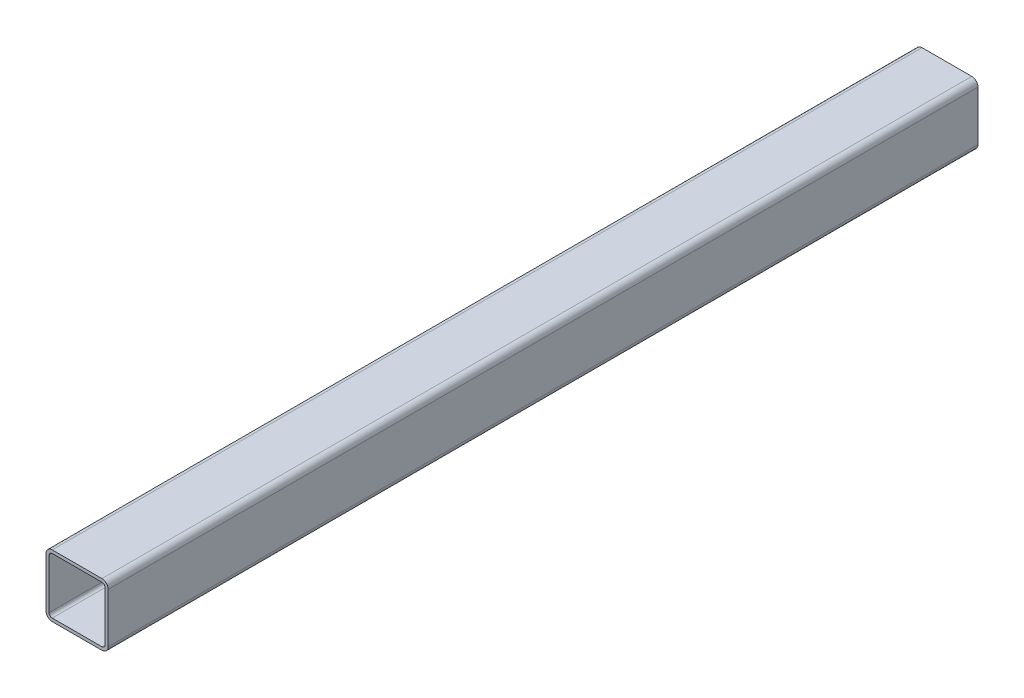
ISO-10303-21;
HEADER;
FILE_DESCRIPTION(('STEP AP214'),'2;1');
FILE_NAME('part.step','',(''),(''),'','','');
FILE_SCHEMA(('AUTOMOTIVE_DESIGN { 1 0 10303 214 1 1 1 1 }'));
ENDSEC;
DATA;
#1=APPLICATION_CONTEXT('core data for automotive mechanical design processes');
#2=APPLICATION_PROTOCOL_DEFINITION('international standard','automotive_design',2000,#1);
#3=PRODUCT_CONTEXT('',#1,'mechanical');
#4=PRODUCT('Part','Part','',(#3));
#5=PRODUCT_RELATED_PRODUCT_CATEGORY('part','',(#4));
#6=PRODUCT_DEFINITION_FORMATION('','',#4);
#7=PRODUCT_DEFINITION_CONTEXT('part definition',#1,'design');
#8=PRODUCT_DEFINITION('design','',#6,#7);
#9=PRODUCT_DEFINITION_SHAPE('','',#8);
#10=(LENGTH_UNIT() NAMED_UNIT(*) SI_UNIT(.MILLI.,.METRE.));
#11=(NAMED_UNIT(*) PLANE_ANGLE_UNIT() SI_UNIT($,.RADIAN.));
#12=(NAMED_UNIT(*) SI_UNIT($,.STERADIAN.) SOLID_ANGLE_UNIT());
#13=UNCERTAINTY_MEASURE_WITH_UNIT(LENGTH_MEASURE(1.E-05),#10,'distance_accuracy_value','');
#14=(GEOMETRIC_REPRESENTATION_CONTEXT(3) GLOBAL_UNCERTAINTY_ASSIGNED_CONTEXT((#13)) GLOBAL_UNIT_ASSIGNED_CONTEXT((#10,
#11,#12)) REPRESENTATION_CONTEXT('',''));
#15=CARTESIAN_POINT('',(0.,0.,0.));
#16=DIRECTION('',(0.,0.,1.));
#17=DIRECTION('',(1.,0.,0.));
#18=AXIS2_PLACEMENT_3D('',#15,#16,#17);
#19=CARTESIAN_POINT('',(16.,-16.,560.));
#20=DIRECTION('',(0.,0.,-1.));
#21=DIRECTION('',(-1.,0.,0.));
#22=AXIS2_PLACEMENT_3D('',#19,#20,#21);
#23=PLANE('',#22);
#24=CARTESIAN_POINT('',(16.,-16.,560.));
#25=DIRECTION('',(0.,0.,1.));
#26=DIRECTION('',(-1.,0.,0.));
#27=AXIS2_PLACEMENT_3D('',#24,#25,#26);
#28=CIRCLE('',#27,4.);
#29=CARTESIAN_POINT('',(16.,-20.,560.));
#30=VERTEX_POINT('',#29);
#31=CARTESIAN_POINT('',(20.,-16.,560.));
#32=VERTEX_POINT('',#31);
#33=EDGE_CURVE('E212',#30,#32,#28,.T.);
#34=ORIENTED_EDGE('',*,*,#33,.T.);
#35=DIRECTION('',(0.,1.,0.));
#36=VECTOR('',#35,1.);
#37=CARTESIAN_POINT('',(20.,16.,560.));
#38=LINE('',#37,#36);
#39=CARTESIAN_POINT('',(20.,16.,560.));
#40=VERTEX_POINT('',#39);
#41=EDGE_CURVE('E215',#32,#40,#38,.T.);
#42=ORIENTED_EDGE('',*,*,#41,.T.);
#43=CARTESIAN_POINT('',(16.,16.,560.));
#44=DIRECTION('',(0.,0.,1.));
#45=DIRECTION('',(-1.,0.,0.));
#46=AXIS2_PLACEMENT_3D('',#43,#44,#45);
#47=CIRCLE('',#46,4.);
#48=CARTESIAN_POINT('',(16.,20.,560.));
#49=VERTEX_POINT('',#48);
#50=EDGE_CURVE('E218',#40,#49,#47,.T.);
#51=ORIENTED_EDGE('',*,*,#50,.T.);
#52=DIRECTION('',(-1.,0.,0.));
#53=VECTOR('',#52,1.);
#54=CARTESIAN_POINT('',(-16.,20.,560.));
#55=LINE('',#54,#53);
#56=CARTESIAN_POINT('',(-16.,20.,560.));
#57=VERTEX_POINT('',#56);
#58=EDGE_CURVE('E220',#49,#57,#55,.T.);
#59=ORIENTED_EDGE('',*,*,#58,.T.);
#60=CARTESIAN_POINT('',(-16.,16.,560.));
#61=DIRECTION('',(0.,0.,1.));
#62=DIRECTION('',(1.,0.,0.));
#63=AXIS2_PLACEMENT_3D('',#60,#61,#62);
#64=CIRCLE('',#63,4.);
#65=CARTESIAN_POINT('',(-20.,16.,560.));
#66=VERTEX_POINT('',#65);
#67=EDGE_CURVE('E222',#57,#66,#64,.T.);
#68=ORIENTED_EDGE('',*,*,#67,.T.);
#69=DIRECTION('',(0.,-1.,0.));
#70=VECTOR('',#69,1.);
#71=CARTESIAN_POINT('',(-20.,16.,560.));
#72=LINE('',#71,#70);
#73=CARTESIAN_POINT('',(-20.,-16.,560.));
#74=VERTEX_POINT('',#73);
#75=EDGE_CURVE('E224',#66,#74,#72,.T.);
#76=ORIENTED_EDGE('',*,*,#75,.T.);
#77=CARTESIAN_POINT('',(-16.,-16.,560.));
#78=DIRECTION('',(0.,0.,1.));
#79=DIRECTION('',(1.,0.,0.));
#80=AXIS2_PLACEMENT_3D('',#77,#78,#79);
#81=CIRCLE('',#80,4.);
#82=CARTESIAN_POINT('',(-16.,-20.,560.));
#83=VERTEX_POINT('',#82);
#84=EDGE_CURVE('E226',#74,#83,#81,.T.);
#85=ORIENTED_EDGE('',*,*,#84,.T.);
#86=DIRECTION('',(1.,0.,0.));
#87=VECTOR('',#86,1.);
#88=CARTESIAN_POINT('',(-16.,-20.,560.));
#89=LINE('',#88,#87);
#90=EDGE_CURVE('E228',#83,#30,#89,.T.);
#91=ORIENTED_EDGE('',*,*,#90,.T.);
#92=EDGE_LOOP('',(#34,#42,#51,#59,#68,#76,#85,#91));
#93=FACE_BOUND('',#92,.T.);
#94=CARTESIAN_POINT('',(-16.,16.,560.));
#95=DIRECTION('',(0.,0.,1.));
#96=DIRECTION('',(1.,0.,0.));
#97=AXIS2_PLACEMENT_3D('',#94,#95,#96);
#98=CIRCLE('',#97,2.);
#99=CARTESIAN_POINT('',(-16.,18.,560.));
#100=VERTEX_POINT('',#99);
#101=CARTESIAN_POINT('',(-18.,16.,560.));
#102=VERTEX_POINT('',#101);
#103=EDGE_CURVE('E147',#100,#102,#98,.T.);
#104=ORIENTED_EDGE('',*,*,#103,.F.);
#105=DIRECTION('',(-1.,0.,0.));
#106=VECTOR('',#105,1.);
#107=CARTESIAN_POINT('',(-16.,18.,560.));
#108=LINE('',#107,#106);
#109=CARTESIAN_POINT('',(16.,18.,560.));
#110=VERTEX_POINT('',#109);
#111=EDGE_CURVE('E180',#110,#100,#108,.T.);
#112=ORIENTED_EDGE('',*,*,#111,.F.);
#113=CARTESIAN_POINT('',(16.,16.,560.));
#114=DIRECTION('',(0.,0.,1.));
#115=DIRECTION('',(-1.,0.,0.));
#116=AXIS2_PLACEMENT_3D('',#113,#114,#115);
#117=CIRCLE('',#116,2.);
#118=CARTESIAN_POINT('',(18.,16.,560.));
#119=VERTEX_POINT('',#118);
#120=EDGE_CURVE('E178',#119,#110,#117,.T.);
#121=ORIENTED_EDGE('',*,*,#120,.F.);
#122=DIRECTION('',(0.,1.,0.));
#123=VECTOR('',#122,1.);
#124=CARTESIAN_POINT('',(18.,16.,560.));
#125=LINE('',#124,#123);
#126=CARTESIAN_POINT('',(18.,-16.,560.));
#127=VERTEX_POINT('',#126);
#128=EDGE_CURVE('E176',#127,#119,#125,.T.);
#129=ORIENTED_EDGE('',*,*,#128,.F.);
#130=CARTESIAN_POINT('',(16.,-16.,560.));
#131=DIRECTION('',(0.,0.,1.));
#132=DIRECTION('',(-1.,0.,0.));
#133=AXIS2_PLACEMENT_3D('',#130,#131,#132);
#134=CIRCLE('',#133,2.);
#135=CARTESIAN_POINT('',(16.,-18.,560.));
#136=VERTEX_POINT('',#135);
#137=EDGE_CURVE('E174',#136,#127,#134,.T.);
#138=ORIENTED_EDGE('',*,*,#137,.F.);
#139=DIRECTION('',(1.,0.,0.));
#140=VECTOR('',#139,1.);
#141=CARTESIAN_POINT('',(-16.,-18.,560.));
#142=LINE('',#141,#140);
#143=CARTESIAN_POINT('',(-16.,-18.,560.));
#144=VERTEX_POINT('',#143);
#145=EDGE_CURVE('E170',#144,#136,#142,.T.);
#146=ORIENTED_EDGE('',*,*,#145,.F.);
#147=CARTESIAN_POINT('',(-16.,-16.,560.));
#148=DIRECTION('',(0.,0.,1.));
#149=DIRECTION('',(1.,0.,0.));
#150=AXIS2_PLACEMENT_3D('',#147,#148,#149);
#151=CIRCLE('',#150,2.);
#152=CARTESIAN_POINT('',(-18.,-16.,560.));
#153=VERTEX_POINT('',#152);
#154=EDGE_CURVE('E168',#153,#144,#151,.T.);
#155=ORIENTED_EDGE('',*,*,#154,.F.);
#156=DIRECTION('',(0.,-1.,0.));
#157=VECTOR('',#156,1.);
#158=CARTESIAN_POINT('',(-18.,16.,560.));
#159=LINE('',#158,#157);
#160=EDGE_CURVE('E155',#102,#153,#159,.T.);
#161=ORIENTED_EDGE('',*,*,#160,.F.);
#162=EDGE_LOOP('',(#104,#112,#121,#129,#138,#146,#155,#161));
#163=FACE_BOUND('',#162,.T.);
#164=ADVANCED_FACE('F34',(#93,#163),#23,.F.);
#165=CARTESIAN_POINT('',(16.,-16.,0.));
#166=DIRECTION('',(0.,0.,-1.));
#167=DIRECTION('',(-1.,0.,0.));
#168=AXIS2_PLACEMENT_3D('',#165,#166,#167);
#169=PLANE('',#168);
#170=CARTESIAN_POINT('',(16.,-16.,0.));
#171=DIRECTION('',(0.,0.,1.));
#172=DIRECTION('',(-1.,0.,0.));
#173=AXIS2_PLACEMENT_3D('',#170,#171,#172);
#174=CIRCLE('',#173,4.);
#175=CARTESIAN_POINT('',(16.,-20.,0.));
#176=VERTEX_POINT('',#175);
#177=CARTESIAN_POINT('',(20.,-16.,0.));
#178=VERTEX_POINT('',#177);
#179=EDGE_CURVE('E163',#176,#178,#174,.T.);
#180=ORIENTED_EDGE('',*,*,#179,.F.);
#181=DIRECTION('',(1.,0.,0.));
#182=VECTOR('',#181,1.);
#183=CARTESIAN_POINT('',(-16.,-20.,0.));
#184=LINE('',#183,#182);
#185=CARTESIAN_POINT('',(-16.,-20.,0.));
#186=VERTEX_POINT('',#185);
#187=EDGE_CURVE('E216',#186,#176,#184,.T.);
#188=ORIENTED_EDGE('',*,*,#187,.F.);
#189=CARTESIAN_POINT('',(-16.,-16.,0.));
#190=DIRECTION('',(0.,0.,1.));
#191=DIRECTION('',(1.,0.,0.));
#192=AXIS2_PLACEMENT_3D('',#189,#190,#191);
#193=CIRCLE('',#192,4.);
#194=CARTESIAN_POINT('',(-20.,-16.,0.));
#195=VERTEX_POINT('',#194);
#196=EDGE_CURVE('E243',#195,#186,#193,.T.);
#197=ORIENTED_EDGE('',*,*,#196,.F.);
#198=DIRECTION('',(0.,-1.,0.));
#199=VECTOR('',#198,1.);
#200=CARTESIAN_POINT('',(-20.,16.,0.));
#201=LINE('',#200,#199);
#202=CARTESIAN_POINT('',(-20.,16.,0.));
#203=VERTEX_POINT('',#202);
#204=EDGE_CURVE('E241',#203,#195,#201,.T.);
#205=ORIENTED_EDGE('',*,*,#204,.F.);
#206=CARTESIAN_POINT('',(-16.,16.,0.));
#207=DIRECTION('',(0.,0.,1.));
#208=DIRECTION('',(1.,0.,0.));
#209=AXIS2_PLACEMENT_3D('',#206,#207,#208);
#210=CIRCLE('',#209,4.);
#211=CARTESIAN_POINT('',(-16.,20.,0.));
#212=VERTEX_POINT('',#211);
#213=EDGE_CURVE('E239',#212,#203,#210,.T.);
#214=ORIENTED_EDGE('',*,*,#213,.F.);
#215=DIRECTION('',(-1.,0.,0.));
#216=VECTOR('',#215,1.);
#217=CARTESIAN_POINT('',(-16.,20.,0.));
#218=LINE('',#217,#216);
#219=CARTESIAN_POINT('',(16.,20.,0.));
#220=VERTEX_POINT('',#219);
#221=EDGE_CURVE('E237',#220,#212,#218,.T.);
#222=ORIENTED_EDGE('',*,*,#221,.F.);
#223=CARTESIAN_POINT('',(16.,16.,0.));
#224=DIRECTION('',(0.,0.,1.));
#225=DIRECTION('',(-1.,0.,0.));
#226=AXIS2_PLACEMENT_3D('',#223,#224,#225);
#227=CIRCLE('',#226,4.);
#228=CARTESIAN_POINT('',(20.,16.,0.));
#229=VERTEX_POINT('',#228);
#230=EDGE_CURVE('E235',#229,#220,#227,.T.);
#231=ORIENTED_EDGE('',*,*,#230,.F.);
#232=DIRECTION('',(0.,1.,0.));
#233=VECTOR('',#232,1.);
#234=CARTESIAN_POINT('',(20.,16.,0.));
#235=LINE('',#234,#233);
#236=EDGE_CURVE('E233',#178,#229,#235,.T.);
#237=ORIENTED_EDGE('',*,*,#236,.F.);
#238=EDGE_LOOP('',(#180,#188,#197,#205,#214,#222,#231,#237));
#239=FACE_BOUND('',#238,.T.);
#240=DIRECTION('',(-1.,0.,0.));
#241=VECTOR('',#240,1.);
#242=CARTESIAN_POINT('',(-16.,18.,0.));
#243=LINE('',#242,#241);
#244=CARTESIAN_POINT('',(16.,18.,0.));
#245=VERTEX_POINT('',#244);
#246=CARTESIAN_POINT('',(-16.,18.,0.));
#247=VERTEX_POINT('',#246);
#248=EDGE_CURVE('E156',#245,#247,#243,.T.);
#249=ORIENTED_EDGE('',*,*,#248,.T.);
#250=CARTESIAN_POINT('',(-16.,16.,0.));
#251=DIRECTION('',(0.,0.,1.));
#252=DIRECTION('',(1.,0.,0.));
#253=AXIS2_PLACEMENT_3D('',#250,#251,#252);
#254=CIRCLE('',#253,2.);
#255=CARTESIAN_POINT('',(-18.,16.,0.));
#256=VERTEX_POINT('',#255);
#257=EDGE_CURVE('E57',#247,#256,#254,.T.);
#258=ORIENTED_EDGE('',*,*,#257,.T.);
#259=DIRECTION('',(0.,-1.,0.));
#260=VECTOR('',#259,1.);
#261=CARTESIAN_POINT('',(-18.,16.,0.));
#262=LINE('',#261,#260);
#263=CARTESIAN_POINT('',(-18.,-16.,0.));
#264=VERTEX_POINT('',#263);
#265=EDGE_CURVE('E162',#256,#264,#262,.T.);
#266=ORIENTED_EDGE('',*,*,#265,.T.);
#267=CARTESIAN_POINT('',(-16.,-16.,0.));
#268=DIRECTION('',(0.,0.,1.));
#269=DIRECTION('',(1.,0.,0.));
#270=AXIS2_PLACEMENT_3D('',#267,#268,#269);
#271=CIRCLE('',#270,2.);
#272=CARTESIAN_POINT('',(-16.,-18.,0.));
#273=VERTEX_POINT('',#272);
#274=EDGE_CURVE('E184',#264,#273,#271,.T.);
#275=ORIENTED_EDGE('',*,*,#274,.T.);
#276=DIRECTION('',(1.,0.,0.));
#277=VECTOR('',#276,1.);
#278=CARTESIAN_POINT('',(-16.,-18.,0.));
#279=LINE('',#278,#277);
#280=CARTESIAN_POINT('',(16.,-18.,0.));
#281=VERTEX_POINT('',#280);
#282=EDGE_CURVE('E187',#273,#281,#279,.T.);
#283=ORIENTED_EDGE('',*,*,#282,.T.);
#284=CARTESIAN_POINT('',(16.,-16.,0.));
#285=DIRECTION('',(0.,0.,1.));
#286=DIRECTION('',(-1.,0.,0.));
#287=AXIS2_PLACEMENT_3D('',#284,#285,#286);
#288=CIRCLE('',#287,2.);
#289=CARTESIAN_POINT('',(18.,-16.,0.));
#290=VERTEX_POINT('',#289);
#291=EDGE_CURVE('E190',#281,#290,#288,.T.);
#292=ORIENTED_EDGE('',*,*,#291,.T.);
#293=DIRECTION('',(0.,1.,0.));
#294=VECTOR('',#293,1.);
#295=CARTESIAN_POINT('',(18.,16.,0.));
#296=LINE('',#295,#294);
#297=CARTESIAN_POINT('',(18.,16.,0.));
#298=VERTEX_POINT('',#297);
#299=EDGE_CURVE('E193',#290,#298,#296,.T.);
#300=ORIENTED_EDGE('',*,*,#299,.T.);
#301=CARTESIAN_POINT('',(16.,16.,0.));
#302=DIRECTION('',(0.,0.,1.));
#303=DIRECTION('',(-1.,0.,0.));
#304=AXIS2_PLACEMENT_3D('',#301,#302,#303);
#305=CIRCLE('',#304,2.);
#306=EDGE_CURVE('E196',#298,#245,#305,.T.);
#307=ORIENTED_EDGE('',*,*,#306,.T.);
#308=EDGE_LOOP('',(#249,#258,#266,#275,#283,#292,#300,#307));
#309=FACE_BOUND('',#308,.T.);
#310=ADVANCED_FACE('F273',(#239,#309),#169,.T.);
#311=CARTESIAN_POINT('',(16.,-16.,560.));
#312=DIRECTION('',(0.,0.,-1.));
#313=DIRECTION('',(-1.,0.,0.));
#314=AXIS2_PLACEMENT_3D('',#311,#312,#313);
#315=CYLINDRICAL_SURFACE('',#314,4.);
#316=ORIENTED_EDGE('',*,*,#179,.T.);
#317=DIRECTION('',(0.,0.,-1.));
#318=VECTOR('',#317,1.);
#319=CARTESIAN_POINT('',(20.,-16.,560.));
#320=LINE('',#319,#318);
#321=EDGE_CURVE('E11',#32,#178,#320,.T.);
#322=ORIENTED_EDGE('',*,*,#321,.F.);
#323=ORIENTED_EDGE('',*,*,#33,.F.);
#324=DIRECTION('',(0.,0.,-1.));
#325=VECTOR('',#324,1.);
#326=CARTESIAN_POINT('',(16.,-20.,560.));
#327=LINE('',#326,#325);
#328=EDGE_CURVE('E230',#30,#176,#327,.T.);
#329=ORIENTED_EDGE('',*,*,#328,.T.);
#330=EDGE_LOOP('',(#316,#322,#323,#329));
#331=FACE_BOUND('',#330,.T.);
#332=ADVANCED_FACE('F36',(#331),#315,.T.);
#333=CARTESIAN_POINT('',(20.,16.,560.));
#334=DIRECTION('',(-1.,0.,0.));
#335=DIRECTION('',(0.,-1.,0.));
#336=AXIS2_PLACEMENT_3D('',#333,#334,#335);
#337=PLANE('',#336);
#338=ORIENTED_EDGE('',*,*,#236,.T.);
#339=DIRECTION('',(0.,0.,-1.));
#340=VECTOR('',#339,1.);
#341=CARTESIAN_POINT('',(20.,16.,560.));
#342=LINE('',#341,#340);
#343=EDGE_CURVE('E42',#40,#229,#342,.T.);
#344=ORIENTED_EDGE('',*,*,#343,.F.);
#345=ORIENTED_EDGE('',*,*,#41,.F.);
#346=ORIENTED_EDGE('',*,*,#321,.T.);
#347=EDGE_LOOP('',(#338,#344,#345,#346));
#348=FACE_BOUND('',#347,.T.);
#349=ADVANCED_FACE('F290',(#348),#337,.F.);
#350=CARTESIAN_POINT('',(16.,16.,560.));
#351=DIRECTION('',(0.,0.,-1.));
#352=DIRECTION('',(-1.,0.,0.));
#353=AXIS2_PLACEMENT_3D('',#350,#351,#352);
#354=CYLINDRICAL_SURFACE('',#353,4.);
#355=ORIENTED_EDGE('',*,*,#230,.T.);
#356=DIRECTION('',(0.,0.,-1.));
#357=VECTOR('',#356,1.);
#358=CARTESIAN_POINT('',(16.,20.,560.));
#359=LINE('',#358,#357);
#360=EDGE_CURVE('E260',#49,#220,#359,.T.);
#361=ORIENTED_EDGE('',*,*,#360,.F.);
#362=ORIENTED_EDGE('',*,*,#50,.F.);
#363=ORIENTED_EDGE('',*,*,#343,.T.);
#364=EDGE_LOOP('',(#355,#361,#362,#363));
#365=FACE_BOUND('',#364,.T.);
#366=ADVANCED_FACE('F267',(#365),#354,.T.);
#367=CARTESIAN_POINT('',(-16.,20.,560.));
#368=DIRECTION('',(0.,-1.,0.));
#369=DIRECTION('',(0.,0.,-1.));
#370=AXIS2_PLACEMENT_3D('',#367,#368,#369);
#371=PLANE('',#370);
#372=ORIENTED_EDGE('',*,*,#221,.T.);
#373=DIRECTION('',(0.,0.,-1.));
#374=VECTOR('',#373,1.);
#375=CARTESIAN_POINT('',(-16.,20.,560.));
#376=LINE('',#375,#374);
#377=EDGE_CURVE('E257',#57,#212,#376,.T.);
#378=ORIENTED_EDGE('',*,*,#377,.F.);
#379=ORIENTED_EDGE('',*,*,#58,.F.);
#380=ORIENTED_EDGE('',*,*,#360,.T.);
#381=EDGE_LOOP('',(#372,#378,#379,#380));
#382=FACE_BOUND('',#381,.T.);
#383=ADVANCED_FACE('F279',(#382),#371,.F.);
#384=CARTESIAN_POINT('',(-16.,16.,560.));
#385=DIRECTION('',(0.,0.,-1.));
#386=DIRECTION('',(-1.,0.,0.));
#387=AXIS2_PLACEMENT_3D('',#384,#385,#386);
#388=CYLINDRICAL_SURFACE('',#387,4.);
#389=ORIENTED_EDGE('',*,*,#213,.T.);
#390=DIRECTION('',(0.,0.,-1.));
#391=VECTOR('',#390,1.);
#392=CARTESIAN_POINT('',(-20.,16.,560.));
#393=LINE('',#392,#391);
#394=EDGE_CURVE('E254',#66,#203,#393,.T.);
#395=ORIENTED_EDGE('',*,*,#394,.F.);
#396=ORIENTED_EDGE('',*,*,#67,.F.);
#397=ORIENTED_EDGE('',*,*,#377,.T.);
#398=EDGE_LOOP('',(#389,#395,#396,#397));
#399=FACE_BOUND('',#398,.T.);
#400=ADVANCED_FACE('F283',(#399),#388,.T.);
#401=CARTESIAN_POINT('',(-20.,16.,560.));
#402=DIRECTION('',(1.,0.,0.));
#403=DIRECTION('',(0.,1.,0.));
#404=AXIS2_PLACEMENT_3D('',#401,#402,#403);
#405=PLANE('',#404);
#406=ORIENTED_EDGE('',*,*,#204,.T.);
#407=DIRECTION('',(0.,0.,-1.));
#408=VECTOR('',#407,1.);
#409=CARTESIAN_POINT('',(-20.,-16.,560.));
#410=LINE('',#409,#408);
#411=EDGE_CURVE('E251',#74,#195,#410,.T.);
#412=ORIENTED_EDGE('',*,*,#411,.F.);
#413=ORIENTED_EDGE('',*,*,#75,.F.);
#414=ORIENTED_EDGE('',*,*,#394,.T.);
#415=EDGE_LOOP('',(#406,#412,#413,#414));
#416=FACE_BOUND('',#415,.T.);
#417=ADVANCED_FACE('F303',(#416),#405,.F.);
#418=CARTESIAN_POINT('',(-16.,-16.,560.));
#419=DIRECTION('',(0.,0.,-1.));
#420=DIRECTION('',(-1.,0.,0.));
#421=AXIS2_PLACEMENT_3D('',#418,#419,#420);
#422=CYLINDRICAL_SURFACE('',#421,4.);
#423=ORIENTED_EDGE('',*,*,#196,.T.);
#424=DIRECTION('',(0.,0.,-1.));
#425=VECTOR('',#424,1.);
#426=CARTESIAN_POINT('',(-16.,-20.,560.));
#427=LINE('',#426,#425);
#428=EDGE_CURVE('E248',#83,#186,#427,.T.);
#429=ORIENTED_EDGE('',*,*,#428,.F.);
#430=ORIENTED_EDGE('',*,*,#84,.F.);
#431=ORIENTED_EDGE('',*,*,#411,.T.);
#432=EDGE_LOOP('',(#423,#429,#430,#431));
#433=FACE_BOUND('',#432,.T.);
#434=ADVANCED_FACE('F301',(#433),#422,.T.);
#435=CARTESIAN_POINT('',(-16.,-20.,560.));
#436=DIRECTION('',(0.,1.,0.));
#437=DIRECTION('',(0.,0.,1.));
#438=AXIS2_PLACEMENT_3D('',#435,#436,#437);
#439=PLANE('',#438);
#440=ORIENTED_EDGE('',*,*,#187,.T.);
#441=ORIENTED_EDGE('',*,*,#328,.F.);
#442=ORIENTED_EDGE('',*,*,#90,.F.);
#443=ORIENTED_EDGE('',*,*,#428,.T.);
#444=EDGE_LOOP('',(#440,#441,#442,#443));
#445=FACE_BOUND('',#444,.T.);
#446=ADVANCED_FACE('F296',(#445),#439,.F.);
#447=CARTESIAN_POINT('',(-16.,16.,560.));
#448=DIRECTION('',(0.,0.,-1.));
#449=DIRECTION('',(-1.,0.,0.));
#450=AXIS2_PLACEMENT_3D('',#447,#448,#449);
#451=CYLINDRICAL_SURFACE('',#450,2.);
#452=ORIENTED_EDGE('',*,*,#257,.F.);
#453=DIRECTION('',(0.,0.,-1.));
#454=VECTOR('',#453,1.);
#455=CARTESIAN_POINT('',(-16.,18.,560.));
#456=LINE('',#455,#454);
#457=EDGE_CURVE('E151',#100,#247,#456,.T.);
#458=ORIENTED_EDGE('',*,*,#457,.F.);
#459=ORIENTED_EDGE('',*,*,#103,.T.);
#460=DIRECTION('',(0.,0.,-1.));
#461=VECTOR('',#460,1.);
#462=CARTESIAN_POINT('',(-18.,16.,560.));
#463=LINE('',#462,#461);
#464=EDGE_CURVE('E150',#102,#256,#463,.T.);
#465=ORIENTED_EDGE('',*,*,#464,.T.);
#466=EDGE_LOOP('',(#452,#458,#459,#465));
#467=FACE_BOUND('',#466,.T.);
#468=ADVANCED_FACE('F149',(#467),#451,.F.);
#469=CARTESIAN_POINT('',(-18.,16.,560.));
#470=DIRECTION('',(1.,0.,0.));
#471=DIRECTION('',(0.,1.,0.));
#472=AXIS2_PLACEMENT_3D('',#469,#470,#471);
#473=PLANE('',#472);
#474=ORIENTED_EDGE('',*,*,#265,.F.);
#475=ORIENTED_EDGE('',*,*,#464,.F.);
#476=ORIENTED_EDGE('',*,*,#160,.T.);
#477=DIRECTION('',(0.,0.,-1.));
#478=VECTOR('',#477,1.);
#479=CARTESIAN_POINT('',(-18.,-16.,560.));
#480=LINE('',#479,#478);
#481=EDGE_CURVE('E164',#153,#264,#480,.T.);
#482=ORIENTED_EDGE('',*,*,#481,.T.);
#483=EDGE_LOOP('',(#474,#475,#476,#482));
#484=FACE_BOUND('',#483,.T.);
#485=ADVANCED_FACE('F159',(#484),#473,.T.);
#486=CARTESIAN_POINT('',(-16.,-16.,560.));
#487=DIRECTION('',(0.,0.,-1.));
#488=DIRECTION('',(-1.,0.,0.));
#489=AXIS2_PLACEMENT_3D('',#486,#487,#488);
#490=CYLINDRICAL_SURFACE('',#489,2.);
#491=ORIENTED_EDGE('',*,*,#274,.F.);
#492=ORIENTED_EDGE('',*,*,#481,.F.);
#493=ORIENTED_EDGE('',*,*,#154,.T.);
#494=DIRECTION('',(0.,0.,-1.));
#495=VECTOR('',#494,1.);
#496=CARTESIAN_POINT('',(-16.,-18.,560.));
#497=LINE('',#496,#495);
#498=EDGE_CURVE('E209',#144,#273,#497,.T.);
#499=ORIENTED_EDGE('',*,*,#498,.T.);
#500=EDGE_LOOP('',(#491,#492,#493,#499));
#501=FACE_BOUND('',#500,.T.);
#502=ADVANCED_FACE('F328',(#501),#490,.F.);
#503=CARTESIAN_POINT('',(-16.,-18.,560.));
#504=DIRECTION('',(0.,1.,0.));
#505=DIRECTION('',(0.,0.,1.));
#506=AXIS2_PLACEMENT_3D('',#503,#504,#505);
#507=PLANE('',#506);
#508=ORIENTED_EDGE('',*,*,#282,.F.);
#509=ORIENTED_EDGE('',*,*,#498,.F.);
#510=ORIENTED_EDGE('',*,*,#145,.T.);
#511=DIRECTION('',(0.,0.,-1.));
#512=VECTOR('',#511,1.);
#513=CARTESIAN_POINT('',(16.,-18.,560.));
#514=LINE('',#513,#512);
#515=EDGE_CURVE('E207',#136,#281,#514,.T.);
#516=ORIENTED_EDGE('',*,*,#515,.T.);
#517=EDGE_LOOP('',(#508,#509,#510,#516));
#518=FACE_BOUND('',#517,.T.);
#519=ADVANCED_FACE('F332',(#518),#507,.T.);
#520=CARTESIAN_POINT('',(16.,-16.,560.));
#521=DIRECTION('',(0.,0.,-1.));
#522=DIRECTION('',(-1.,0.,0.));
#523=AXIS2_PLACEMENT_3D('',#520,#521,#522);
#524=CYLINDRICAL_SURFACE('',#523,2.);
#525=ORIENTED_EDGE('',*,*,#291,.F.);
#526=ORIENTED_EDGE('',*,*,#515,.F.);
#527=ORIENTED_EDGE('',*,*,#137,.T.);
#528=DIRECTION('',(0.,0.,-1.));
#529=VECTOR('',#528,1.);
#530=CARTESIAN_POINT('',(18.,-16.,560.));
#531=LINE('',#530,#529);
#532=EDGE_CURVE('E205',#127,#290,#531,.T.);
#533=ORIENTED_EDGE('',*,*,#532,.T.);
#534=EDGE_LOOP('',(#525,#526,#527,#533));
#535=FACE_BOUND('',#534,.T.);
#536=ADVANCED_FACE('F338',(#535),#524,.F.);
#537=CARTESIAN_POINT('',(18.,16.,560.));
#538=DIRECTION('',(-1.,0.,0.));
#539=DIRECTION('',(0.,0.,1.));
#540=AXIS2_PLACEMENT_3D('',#537,#538,#539);
#541=PLANE('',#540);
#542=ORIENTED_EDGE('',*,*,#299,.F.);
#543=ORIENTED_EDGE('',*,*,#532,.F.);
#544=ORIENTED_EDGE('',*,*,#128,.T.);
#545=DIRECTION('',(0.,0.,-1.));
#546=VECTOR('',#545,1.);
#547=CARTESIAN_POINT('',(18.,16.,560.));
#548=LINE('',#547,#546);
#549=EDGE_CURVE('E203',#119,#298,#548,.T.);
#550=ORIENTED_EDGE('',*,*,#549,.T.);
#551=EDGE_LOOP('',(#542,#543,#544,#550));
#552=FACE_BOUND('',#551,.T.);
#553=ADVANCED_FACE('F342',(#552),#541,.T.);
#554=CARTESIAN_POINT('',(16.,16.,560.));
#555=DIRECTION('',(0.,0.,-1.));
#556=DIRECTION('',(-1.,0.,0.));
#557=AXIS2_PLACEMENT_3D('',#554,#555,#556);
#558=CYLINDRICAL_SURFACE('',#557,2.);
#559=ORIENTED_EDGE('',*,*,#306,.F.);
#560=ORIENTED_EDGE('',*,*,#549,.F.);
#561=ORIENTED_EDGE('',*,*,#120,.T.);
#562=DIRECTION('',(0.,0.,-1.));
#563=VECTOR('',#562,1.);
#564=CARTESIAN_POINT('',(16.,18.,560.));
#565=LINE('',#564,#563);
#566=EDGE_CURVE('E49',#110,#245,#565,.T.);
#567=ORIENTED_EDGE('',*,*,#566,.T.);
#568=EDGE_LOOP('',(#559,#560,#561,#567));
#569=FACE_BOUND('',#568,.T.);
#570=ADVANCED_FACE('F346',(#569),#558,.F.);
#571=CARTESIAN_POINT('',(-16.,18.,560.));
#572=DIRECTION('',(0.,-1.,0.));
#573=DIRECTION('',(0.,0.,-1.));
#574=AXIS2_PLACEMENT_3D('',#571,#572,#573);
#575=PLANE('',#574);
#576=ORIENTED_EDGE('',*,*,#248,.F.);
#577=ORIENTED_EDGE('',*,*,#566,.F.);
#578=ORIENTED_EDGE('',*,*,#111,.T.);
#579=ORIENTED_EDGE('',*,*,#457,.T.);
#580=EDGE_LOOP('',(#576,#577,#578,#579));
#581=FACE_BOUND('',#580,.T.);
#582=ADVANCED_FACE('F350',(#581),#575,.T.);
#583=CLOSED_SHELL('',(#164,#310,#332,#349,#366,#383,#400,#417,#434,#446,#468,#485,#502,#519,
#536,#553,#570,#582));
#584=MANIFOLD_SOLID_BREP('B2',#583);
#585=ADVANCED_BREP_SHAPE_REPRESENTATION('',(#18,#584),#14);
#586=SHAPE_DEFINITION_REPRESENTATION(#9,#585);
ENDSEC;
END-ISO-10303-21;
